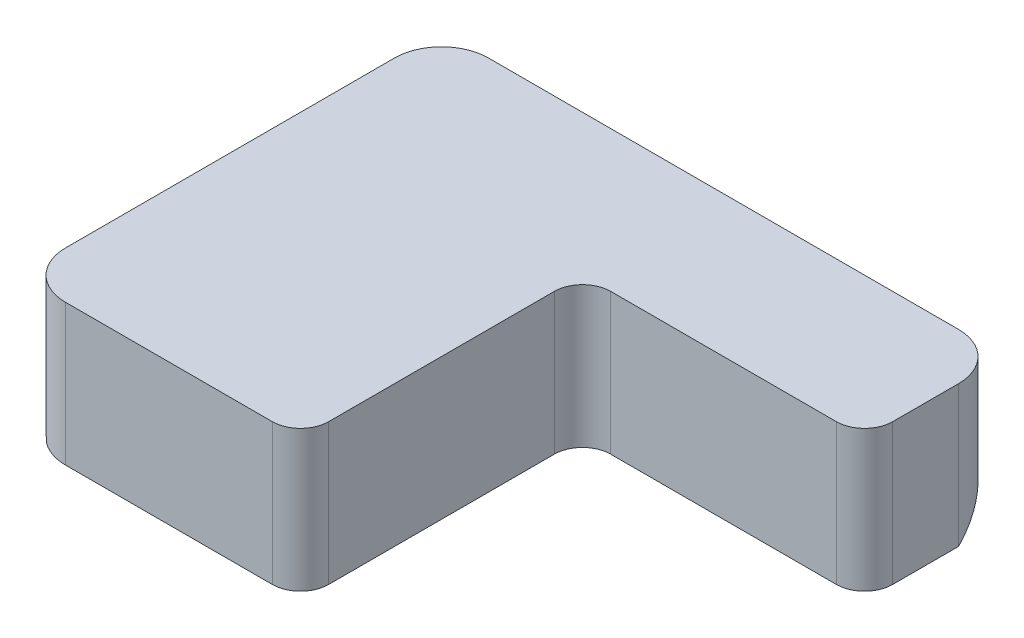
ISO-10303-21;
HEADER;
FILE_DESCRIPTION(('STEP AP214'),'2;1');
FILE_NAME('part.step','',(''),(''),'','','');
FILE_SCHEMA(('AUTOMOTIVE_DESIGN { 1 0 10303 214 1 1 1 1 }'));
ENDSEC;
DATA;
#1=APPLICATION_CONTEXT('core data for automotive mechanical design processes');
#2=APPLICATION_PROTOCOL_DEFINITION('international standard','automotive_design',2000,#1);
#3=PRODUCT_CONTEXT('',#1,'mechanical');
#4=PRODUCT('Part','Part','',(#3));
#5=PRODUCT_RELATED_PRODUCT_CATEGORY('part','',(#4));
#6=PRODUCT_DEFINITION_FORMATION('','',#4);
#7=PRODUCT_DEFINITION_CONTEXT('part definition',#1,'design');
#8=PRODUCT_DEFINITION('design','',#6,#7);
#9=PRODUCT_DEFINITION_SHAPE('','',#8);
#10=(LENGTH_UNIT() NAMED_UNIT(*) SI_UNIT(.MILLI.,.METRE.));
#11=(NAMED_UNIT(*) PLANE_ANGLE_UNIT() SI_UNIT($,.RADIAN.));
#12=(NAMED_UNIT(*) SI_UNIT($,.STERADIAN.) SOLID_ANGLE_UNIT());
#13=UNCERTAINTY_MEASURE_WITH_UNIT(LENGTH_MEASURE(1.E-05),#10,'distance_accuracy_value','');
#14=(GEOMETRIC_REPRESENTATION_CONTEXT(3) GLOBAL_UNCERTAINTY_ASSIGNED_CONTEXT((#13)) GLOBAL_UNIT_ASSIGNED_CONTEXT((#10,
#11,#12)) REPRESENTATION_CONTEXT('',''));
#15=CARTESIAN_POINT('',(0.,0.,0.));
#16=DIRECTION('',(0.,0.,1.));
#17=DIRECTION('',(1.,0.,0.));
#18=AXIS2_PLACEMENT_3D('',#15,#16,#17);
#19=CARTESIAN_POINT('',(0.,15.,30.));
#20=DIRECTION('',(-1.,0.,0.));
#21=DIRECTION('',(0.,0.,1.));
#22=AXIS2_PLACEMENT_3D('',#19,#20,#21);
#23=PLANE('',#22);
#24=DIRECTION('',(0.,0.,-1.));
#25=VECTOR('',#24,1.);
#26=CARTESIAN_POINT('',(0.,15.,30.));
#27=LINE('',#26,#25);
#28=CARTESIAN_POINT('',(0.,15.,27.));
#29=VERTEX_POINT('',#28);
#30=CARTESIAN_POINT('',(0.,15.,3.));
#31=VERTEX_POINT('',#30);
#32=EDGE_CURVE('E259',#29,#31,#27,.T.);
#33=ORIENTED_EDGE('',*,*,#32,.F.);
#34=DIRECTION('',(0.,-1.,0.));
#35=VECTOR('',#34,1.);
#36=CARTESIAN_POINT('',(0.,15.,27.));
#37=LINE('',#36,#35);
#38=CARTESIAN_POINT('',(0.,0.,27.));
#39=VERTEX_POINT('',#38);
#40=EDGE_CURVE('E223',#29,#39,#37,.T.);
#41=ORIENTED_EDGE('',*,*,#40,.T.);
#42=DIRECTION('',(0.,0.,-1.));
#43=VECTOR('',#42,1.);
#44=CARTESIAN_POINT('',(0.,0.,30.));
#45=LINE('',#44,#43);
#46=CARTESIAN_POINT('',(0.,0.,3.));
#47=VERTEX_POINT('',#46);
#48=EDGE_CURVE('E254',#39,#47,#45,.T.);
#49=ORIENTED_EDGE('',*,*,#48,.T.);
#50=DIRECTION('',(0.,-1.,0.));
#51=VECTOR('',#50,1.);
#52=CARTESIAN_POINT('',(0.,15.,3.));
#53=LINE('',#52,#51);
#54=EDGE_CURVE('E221',#47,#31,#53,.F.);
#55=ORIENTED_EDGE('',*,*,#54,.T.);
#56=EDGE_LOOP('',(#33,#41,#49,#55));
#57=FACE_BOUND('',#56,.T.);
#58=ADVANCED_FACE('F41',(#57),#23,.F.);
#59=CARTESIAN_POINT('',(0.,15.,0.));
#60=DIRECTION('',(0.,0.,-1.));
#61=DIRECTION('',(-1.,0.,0.));
#62=AXIS2_PLACEMENT_3D('',#59,#60,#61);
#63=PLANE('',#62);
#64=DIRECTION('',(1.,0.,0.));
#65=VECTOR('',#64,1.);
#66=CARTESIAN_POINT('',(0.,0.,0.));
#67=LINE('',#66,#65);
#68=CARTESIAN_POINT('',(3.,0.,0.));
#69=VERTEX_POINT('',#68);
#70=CARTESIAN_POINT('',(27.,0.,0.));
#71=VERTEX_POINT('',#70);
#72=EDGE_CURVE('E168',#69,#71,#67,.T.);
#73=ORIENTED_EDGE('',*,*,#72,.T.);
#74=DIRECTION('',(0.,-1.,0.));
#75=VECTOR('',#74,1.);
#76=CARTESIAN_POINT('',(27.,15.,0.));
#77=LINE('',#76,#75);
#78=CARTESIAN_POINT('',(27.,15.,0.));
#79=VERTEX_POINT('',#78);
#80=EDGE_CURVE('E215',#71,#79,#77,.F.);
#81=ORIENTED_EDGE('',*,*,#80,.T.);
#82=DIRECTION('',(1.,0.,0.));
#83=VECTOR('',#82,1.);
#84=CARTESIAN_POINT('',(0.,15.,0.));
#85=LINE('',#84,#83);
#86=CARTESIAN_POINT('',(3.,15.,0.));
#87=VERTEX_POINT('',#86);
#88=EDGE_CURVE('E249',#87,#79,#85,.T.);
#89=ORIENTED_EDGE('',*,*,#88,.F.);
#90=DIRECTION('',(0.,-1.,0.));
#91=VECTOR('',#90,1.);
#92=CARTESIAN_POINT('',(3.,0.,0.));
#93=LINE('',#92,#91);
#94=EDGE_CURVE('E212',#87,#69,#93,.T.);
#95=ORIENTED_EDGE('',*,*,#94,.T.);
#96=EDGE_LOOP('',(#73,#81,#89,#95));
#97=FACE_BOUND('',#96,.T.);
#98=ADVANCED_FACE('F274',(#97),#63,.F.);
#99=CARTESIAN_POINT('',(30.,15.,0.));
#100=DIRECTION('',(-1.,0.,0.));
#101=DIRECTION('',(0.,0.,1.));
#102=AXIS2_PLACEMENT_3D('',#99,#100,#101);
#103=PLANE('',#102);
#104=DIRECTION('',(0.,0.,-1.));
#105=VECTOR('',#104,1.);
#106=CARTESIAN_POINT('',(30.,0.,0.));
#107=LINE('',#106,#105);
#108=CARTESIAN_POINT('',(30.,0.,-3.));
#109=VERTEX_POINT('',#108);
#110=CARTESIAN_POINT('',(30.,0.,-9.99999999999998));
#111=VERTEX_POINT('',#110);
#112=EDGE_CURVE('E160',#109,#111,#107,.T.);
#113=ORIENTED_EDGE('',*,*,#112,.T.);
#114=DIRECTION('',(0.,-1.,0.));
#115=VECTOR('',#114,1.);
#116=CARTESIAN_POINT('',(30.,15.,-10.));
#117=LINE('',#116,#115);
#118=CARTESIAN_POINT('',(30.,15.,-10.));
#119=VERTEX_POINT('',#118);
#120=EDGE_CURVE('E154',#111,#119,#117,.F.);
#121=ORIENTED_EDGE('',*,*,#120,.T.);
#122=DIRECTION('',(0.,0.,-1.));
#123=VECTOR('',#122,1.);
#124=CARTESIAN_POINT('',(30.,15.,0.));
#125=LINE('',#124,#123);
#126=CARTESIAN_POINT('',(30.,15.,-3.));
#127=VERTEX_POINT('',#126);
#128=EDGE_CURVE('E246',#127,#119,#125,.T.);
#129=ORIENTED_EDGE('',*,*,#128,.F.);
#130=DIRECTION('',(0.,-1.,0.));
#131=VECTOR('',#130,1.);
#132=CARTESIAN_POINT('',(30.,15.,-3.));
#133=LINE('',#132,#131);
#134=EDGE_CURVE('E165',#127,#109,#133,.T.);
#135=ORIENTED_EDGE('',*,*,#134,.T.);
#136=EDGE_LOOP('',(#113,#121,#129,#135));
#137=FACE_BOUND('',#136,.T.);
#138=ADVANCED_FACE('F161',(#137),#103,.F.);
#139=CARTESIAN_POINT('',(30.,15.,-15.));
#140=DIRECTION('',(0.,0.,1.));
#141=DIRECTION('',(1.,0.,0.));
#142=AXIS2_PLACEMENT_3D('',#139,#140,#141);
#143=PLANE('',#142);
#144=DIRECTION('',(-1.,0.,0.));
#145=VECTOR('',#144,1.);
#146=CARTESIAN_POINT('',(30.,15.,-15.));
#147=LINE('',#146,#145);
#148=CARTESIAN_POINT('',(25.,15.,-15.));
#149=VERTEX_POINT('',#148);
#150=CARTESIAN_POINT('',(-25.,15.,-15.));
#151=VERTEX_POINT('',#150);
#152=EDGE_CURVE('E245',#149,#151,#147,.T.);
#153=ORIENTED_EDGE('',*,*,#152,.F.);
#154=DIRECTION('',(0.,-1.,0.));
#155=VECTOR('',#154,1.);
#156=CARTESIAN_POINT('',(25.,15.,-15.));
#157=LINE('',#156,#155);
#158=CARTESIAN_POINT('',(25.,5.,-15.));
#159=VERTEX_POINT('',#158);
#160=EDGE_CURVE('E235',#149,#159,#157,.T.);
#161=ORIENTED_EDGE('',*,*,#160,.T.);
#162=DIRECTION('',(-1.,0.,0.));
#163=VECTOR('',#162,1.);
#164=CARTESIAN_POINT('',(-30.,5.,-15.));
#165=LINE('',#164,#163);
#166=CARTESIAN_POINT('',(-25.,5.,-15.));
#167=VERTEX_POINT('',#166);
#168=EDGE_CURVE('E149',#159,#167,#165,.T.);
#169=ORIENTED_EDGE('',*,*,#168,.T.);
#170=DIRECTION('',(0.,-1.,0.));
#171=VECTOR('',#170,1.);
#172=CARTESIAN_POINT('',(-25.,15.,-15.));
#173=LINE('',#172,#171);
#174=EDGE_CURVE('E233',#167,#151,#173,.F.);
#175=ORIENTED_EDGE('',*,*,#174,.T.);
#176=EDGE_LOOP('',(#153,#161,#169,#175));
#177=FACE_BOUND('',#176,.T.);
#178=ADVANCED_FACE('F239',(#177),#143,.F.);
#179=CARTESIAN_POINT('',(-30.,15.,-15.));
#180=DIRECTION('',(1.,0.,0.));
#181=DIRECTION('',(0.,0.,-1.));
#182=AXIS2_PLACEMENT_3D('',#179,#180,#181);
#183=PLANE('',#182);
#184=DIRECTION('',(0.,0.,1.));
#185=VECTOR('',#184,1.);
#186=CARTESIAN_POINT('',(-30.,2.00000000000002,30.));
#187=LINE('',#186,#185);
#188=CARTESIAN_POINT('',(-30.,2.00000000000002,-9.99999999999999));
#189=VERTEX_POINT('',#188);
#190=CARTESIAN_POINT('',(-30.,2.00000000000002,25.));
#191=VERTEX_POINT('',#190);
#192=EDGE_CURVE('E173',#189,#191,#187,.T.);
#193=ORIENTED_EDGE('',*,*,#192,.T.);
#194=DIRECTION('',(0.,-1.,0.));
#195=VECTOR('',#194,1.);
#196=CARTESIAN_POINT('',(-30.,15.,25.));
#197=LINE('',#196,#195);
#198=CARTESIAN_POINT('',(-30.,15.,25.));
#199=VERTEX_POINT('',#198);
#200=EDGE_CURVE('E11',#191,#199,#197,.F.);
#201=ORIENTED_EDGE('',*,*,#200,.T.);
#202=DIRECTION('',(0.,0.,1.));
#203=VECTOR('',#202,1.);
#204=CARTESIAN_POINT('',(-30.,15.,-15.));
#205=LINE('',#204,#203);
#206=CARTESIAN_POINT('',(-30.,15.,-9.99999999999999));
#207=VERTEX_POINT('',#206);
#208=EDGE_CURVE('E197',#207,#199,#205,.T.);
#209=ORIENTED_EDGE('',*,*,#208,.F.);
#210=DIRECTION('',(0.,-1.,0.));
#211=VECTOR('',#210,1.);
#212=CARTESIAN_POINT('',(-30.,15.,-9.99999999999999));
#213=LINE('',#212,#211);
#214=EDGE_CURVE('E49',#207,#189,#213,.T.);
#215=ORIENTED_EDGE('',*,*,#214,.T.);
#216=EDGE_LOOP('',(#193,#201,#209,#215));
#217=FACE_BOUND('',#216,.T.);
#218=ADVANCED_FACE('F194',(#217),#183,.F.);
#219=CARTESIAN_POINT('',(-30.,15.,30.));
#220=DIRECTION('',(0.,0.,-1.));
#221=DIRECTION('',(-1.,0.,0.));
#222=AXIS2_PLACEMENT_3D('',#219,#220,#221);
#223=PLANE('',#222);
#224=DIRECTION('',(1.,0.,0.));
#225=VECTOR('',#224,1.);
#226=CARTESIAN_POINT('',(-30.,15.,30.));
#227=LINE('',#226,#225);
#228=CARTESIAN_POINT('',(-25.,15.,30.));
#229=VERTEX_POINT('',#228);
#230=CARTESIAN_POINT('',(-3.,15.,30.));
#231=VERTEX_POINT('',#230);
#232=EDGE_CURVE('E241',#229,#231,#227,.T.);
#233=ORIENTED_EDGE('',*,*,#232,.F.);
#234=DIRECTION('',(0.,-1.,0.));
#235=VECTOR('',#234,1.);
#236=CARTESIAN_POINT('',(-25.,15.,30.));
#237=LINE('',#236,#235);
#238=CARTESIAN_POINT('',(-25.,0.,30.));
#239=VERTEX_POINT('',#238);
#240=EDGE_CURVE('E186',#229,#239,#237,.T.);
#241=ORIENTED_EDGE('',*,*,#240,.T.);
#242=DIRECTION('',(1.,0.,0.));
#243=VECTOR('',#242,1.);
#244=CARTESIAN_POINT('',(-30.,0.,30.));
#245=LINE('',#244,#243);
#246=CARTESIAN_POINT('',(-3.,0.,30.));
#247=VERTEX_POINT('',#246);
#248=EDGE_CURVE('E167',#239,#247,#245,.T.);
#249=ORIENTED_EDGE('',*,*,#248,.T.);
#250=DIRECTION('',(0.,-1.,0.));
#251=VECTOR('',#250,1.);
#252=CARTESIAN_POINT('',(-3.,15.,30.));
#253=LINE('',#252,#251);
#254=EDGE_CURVE('E226',#247,#231,#253,.F.);
#255=ORIENTED_EDGE('',*,*,#254,.T.);
#256=EDGE_LOOP('',(#233,#241,#249,#255));
#257=FACE_BOUND('',#256,.T.);
#258=ADVANCED_FACE('F289',(#257),#223,.F.);
#259=CARTESIAN_POINT('',(0.,15.,0.));
#260=DIRECTION('',(0.,-1.,0.));
#261=DIRECTION('',(0.,0.,-1.));
#262=AXIS2_PLACEMENT_3D('',#259,#260,#261);
#263=PLANE('',#262);
#264=ORIENTED_EDGE('',*,*,#128,.T.);
#265=CARTESIAN_POINT('',(25.,15.,-10.));
#266=DIRECTION('',(0.,-1.,0.));
#267=DIRECTION('',(0.,0.,-1.));
#268=AXIS2_PLACEMENT_3D('',#265,#266,#267);
#269=CIRCLE('',#268,5.);
#270=EDGE_CURVE('E177',#119,#149,#269,.F.);
#271=ORIENTED_EDGE('',*,*,#270,.T.);
#272=ORIENTED_EDGE('',*,*,#152,.T.);
#273=CARTESIAN_POINT('',(-25.,15.,-9.99999999999999));
#274=DIRECTION('',(0.,-1.,0.));
#275=DIRECTION('',(0.,0.,-1.));
#276=AXIS2_PLACEMENT_3D('',#273,#274,#275);
#277=CIRCLE('',#276,5.);
#278=EDGE_CURVE('E178',#151,#207,#277,.F.);
#279=ORIENTED_EDGE('',*,*,#278,.T.);
#280=ORIENTED_EDGE('',*,*,#208,.T.);
#281=CARTESIAN_POINT('',(-25.,15.,25.));
#282=DIRECTION('',(0.,-1.,0.));
#283=DIRECTION('',(0.,0.,-1.));
#284=AXIS2_PLACEMENT_3D('',#281,#282,#283);
#285=CIRCLE('',#284,5.);
#286=EDGE_CURVE('E180',#199,#229,#285,.F.);
#287=ORIENTED_EDGE('',*,*,#286,.T.);
#288=ORIENTED_EDGE('',*,*,#232,.T.);
#289=CARTESIAN_POINT('',(-3.,15.,27.));
#290=DIRECTION('',(0.,-1.,0.));
#291=DIRECTION('',(0.,0.,-1.));
#292=AXIS2_PLACEMENT_3D('',#289,#290,#291);
#293=CIRCLE('',#292,3.);
#294=EDGE_CURVE('E217',#231,#29,#293,.F.);
#295=ORIENTED_EDGE('',*,*,#294,.T.);
#296=ORIENTED_EDGE('',*,*,#32,.T.);
#297=CARTESIAN_POINT('',(3.,15.,3.));
#298=DIRECTION('',(0.,-1.,0.));
#299=DIRECTION('',(0.,0.,-1.));
#300=AXIS2_PLACEMENT_3D('',#297,#298,#299);
#301=CIRCLE('',#300,3.);
#302=EDGE_CURVE('E231',#31,#87,#301,.T.);
#303=ORIENTED_EDGE('',*,*,#302,.T.);
#304=ORIENTED_EDGE('',*,*,#88,.T.);
#305=CARTESIAN_POINT('',(27.,15.,-3.));
#306=DIRECTION('',(0.,-1.,0.));
#307=DIRECTION('',(0.,0.,-1.));
#308=AXIS2_PLACEMENT_3D('',#305,#306,#307);
#309=CIRCLE('',#308,3.);
#310=EDGE_CURVE('E219',#79,#127,#309,.F.);
#311=ORIENTED_EDGE('',*,*,#310,.T.);
#312=EDGE_LOOP('',(#264,#271,#272,#279,#280,#287,#288,#295,#296,#303,#304,#311));
#313=FACE_BOUND('',#312,.T.);
#314=ADVANCED_FACE('F243',(#313),#263,.F.);
#315=CARTESIAN_POINT('',(0.,0.,0.));
#316=DIRECTION('',(0.,-1.,0.));
#317=DIRECTION('',(0.,0.,-1.));
#318=AXIS2_PLACEMENT_3D('',#315,#316,#317);
#319=PLANE('',#318);
#320=ORIENTED_EDGE('',*,*,#248,.F.);
#321=CARTESIAN_POINT('',(-25.,0.,25.));
#322=DIRECTION('',(0.,-1.,0.));
#323=DIRECTION('',(0.,0.,-1.));
#324=AXIS2_PLACEMENT_3D('',#321,#322,#323);
#325=CIRCLE('',#324,5.);
#326=CARTESIAN_POINT('',(-28.,0.,29.));
#327=VERTEX_POINT('',#326);
#328=EDGE_CURVE('E189',#239,#327,#325,.T.);
#329=ORIENTED_EDGE('',*,*,#328,.T.);
#330=DIRECTION('',(0.,0.,-1.));
#331=VECTOR('',#330,1.);
#332=CARTESIAN_POINT('',(-28.,0.,-9.99999999999998));
#333=LINE('',#332,#331);
#334=CARTESIAN_POINT('',(-28.,0.,-9.99999999999997));
#335=VERTEX_POINT('',#334);
#336=EDGE_CURVE('E172',#327,#335,#333,.T.);
#337=ORIENTED_EDGE('',*,*,#336,.T.);
#338=DIRECTION('',(1.,0.,0.));
#339=VECTOR('',#338,1.);
#340=CARTESIAN_POINT('',(30.,0.,-9.99999999999998));
#341=LINE('',#340,#339);
#342=EDGE_CURVE('E146',#335,#111,#341,.T.);
#343=ORIENTED_EDGE('',*,*,#342,.T.);
#344=ORIENTED_EDGE('',*,*,#112,.F.);
#345=CARTESIAN_POINT('',(27.,0.,-3.));
#346=DIRECTION('',(0.,-1.,0.));
#347=DIRECTION('',(0.,0.,-1.));
#348=AXIS2_PLACEMENT_3D('',#345,#346,#347);
#349=CIRCLE('',#348,3.);
#350=EDGE_CURVE('E210',#109,#71,#349,.T.);
#351=ORIENTED_EDGE('',*,*,#350,.T.);
#352=ORIENTED_EDGE('',*,*,#72,.F.);
#353=CARTESIAN_POINT('',(3.,0.,3.));
#354=DIRECTION('',(0.,-1.,0.));
#355=DIRECTION('',(0.,0.,-1.));
#356=AXIS2_PLACEMENT_3D('',#353,#354,#355);
#357=CIRCLE('',#356,3.);
#358=EDGE_CURVE('E229',#69,#47,#357,.F.);
#359=ORIENTED_EDGE('',*,*,#358,.T.);
#360=ORIENTED_EDGE('',*,*,#48,.F.);
#361=CARTESIAN_POINT('',(-3.,0.,27.));
#362=DIRECTION('',(0.,-1.,0.));
#363=DIRECTION('',(0.,0.,-1.));
#364=AXIS2_PLACEMENT_3D('',#361,#362,#363);
#365=CIRCLE('',#364,3.);
#366=EDGE_CURVE('E207',#39,#247,#365,.T.);
#367=ORIENTED_EDGE('',*,*,#366,.T.);
#368=EDGE_LOOP('',(#320,#329,#337,#343,#344,#351,#352,#359,#360,#367));
#369=FACE_BOUND('',#368,.T.);
#370=ADVANCED_FACE('F171',(#369),#319,.T.);
#371=CARTESIAN_POINT('',(30.,5.,-15.));
#372=DIRECTION('',(0.,-0.707106781186549,-0.707106781186547));
#373=DIRECTION('',(1.,0.,0.));
#374=AXIS2_PLACEMENT_3D('',#371,#372,#373);
#375=PLANE('',#374);
#376=ORIENTED_EDGE('',*,*,#168,.F.);
#377=CARTESIAN_POINT('',(25.,0.,-10.));
#378=DIRECTION('',(0.,-0.707106781186549,-0.707106781186547));
#379=DIRECTION('',(0.,-0.707106781186547,0.707106781186549));
#380=AXIS2_PLACEMENT_3D('',#377,#378,#379);
#381=ELLIPSE('',#380,7.07106781186546,5.);
#382=EDGE_CURVE('E141',#159,#111,#381,.T.);
#383=ORIENTED_EDGE('',*,*,#382,.T.);
#384=ORIENTED_EDGE('',*,*,#342,.F.);
#385=DIRECTION('',(-0.577350269189625,0.577350269189625,-0.577350269189627));
#386=VECTOR('',#385,1.);
#387=CARTESIAN_POINT('',(-12.,-15.9999999999999,6.00000000000002));
#388=LINE('',#387,#386);
#389=CARTESIAN_POINT('',(-29.7015621187164,1.70156211871644,-11.7015621187164));
#390=VERTEX_POINT('',#389);
#391=EDGE_CURVE('E201',#335,#390,#388,.T.);
#392=ORIENTED_EDGE('',*,*,#391,.T.);
#393=CARTESIAN_POINT('',(-25.,0.,-9.99999999999999));
#394=DIRECTION('',(0.,-0.707106781186549,-0.707106781186547));
#395=DIRECTION('',(0.,-0.707106781186547,0.707106781186549));
#396=AXIS2_PLACEMENT_3D('',#393,#394,#395);
#397=ELLIPSE('',#396,7.07106781186546,5.);
#398=EDGE_CURVE('E155',#390,#167,#397,.T.);
#399=ORIENTED_EDGE('',*,*,#398,.T.);
#400=EDGE_LOOP('',(#376,#383,#384,#392,#399));
#401=FACE_BOUND('',#400,.T.);
#402=ADVANCED_FACE('F143',(#401),#375,.T.);
#403=CARTESIAN_POINT('',(-30.,2.00000000000002,-15.));
#404=DIRECTION('',(-0.707106781186547,-0.707106781186547,0.));
#405=DIRECTION('',(0.,0.,-1.));
#406=AXIS2_PLACEMENT_3D('',#403,#404,#405);
#407=PLANE('',#406);
#408=ORIENTED_EDGE('',*,*,#336,.F.);
#409=CARTESIAN_POINT('',(-25.,-2.99999999999998,25.));
#410=DIRECTION('',(-0.707106781186547,-0.707106781186547,0.));
#411=DIRECTION('',(0.707106781186548,-0.707106781186548,0.));
#412=AXIS2_PLACEMENT_3D('',#409,#410,#411);
#413=ELLIPSE('',#412,7.07106781186548,5.);
#414=EDGE_CURVE('E56',#327,#191,#413,.T.);
#415=ORIENTED_EDGE('',*,*,#414,.T.);
#416=ORIENTED_EDGE('',*,*,#192,.F.);
#417=CARTESIAN_POINT('',(-25.,-2.99999999999998,-9.99999999999999));
#418=DIRECTION('',(-0.707106781186547,-0.707106781186547,0.));
#419=DIRECTION('',(0.707106781186548,-0.707106781186548,0.));
#420=AXIS2_PLACEMENT_3D('',#417,#418,#419);
#421=ELLIPSE('',#420,7.07106781186548,5.);
#422=EDGE_CURVE('E64',#189,#390,#421,.T.);
#423=ORIENTED_EDGE('',*,*,#422,.T.);
#424=ORIENTED_EDGE('',*,*,#391,.F.);
#425=EDGE_LOOP('',(#408,#415,#416,#423,#424));
#426=FACE_BOUND('',#425,.T.);
#427=ADVANCED_FACE('F199',(#426),#407,.T.);
#428=CARTESIAN_POINT('',(27.,15.,-3.));
#429=DIRECTION('',(0.,-1.,0.));
#430=DIRECTION('',(0.,0.,-1.));
#431=AXIS2_PLACEMENT_3D('',#428,#429,#430);
#432=CYLINDRICAL_SURFACE('',#431,3.);
#433=ORIENTED_EDGE('',*,*,#310,.F.);
#434=ORIENTED_EDGE('',*,*,#80,.F.);
#435=ORIENTED_EDGE('',*,*,#350,.F.);
#436=ORIENTED_EDGE('',*,*,#134,.F.);
#437=EDGE_LOOP('',(#433,#434,#435,#436));
#438=FACE_BOUND('',#437,.T.);
#439=ADVANCED_FACE('F272',(#438),#432,.T.);
#440=CARTESIAN_POINT('',(-3.,15.,27.));
#441=DIRECTION('',(0.,-1.,0.));
#442=DIRECTION('',(0.,0.,-1.));
#443=AXIS2_PLACEMENT_3D('',#440,#441,#442);
#444=CYLINDRICAL_SURFACE('',#443,3.);
#445=ORIENTED_EDGE('',*,*,#294,.F.);
#446=ORIENTED_EDGE('',*,*,#254,.F.);
#447=ORIENTED_EDGE('',*,*,#366,.F.);
#448=ORIENTED_EDGE('',*,*,#40,.F.);
#449=EDGE_LOOP('',(#445,#446,#447,#448));
#450=FACE_BOUND('',#449,.T.);
#451=ADVANCED_FACE('F283',(#450),#444,.T.);
#452=CARTESIAN_POINT('',(3.,15.,3.));
#453=DIRECTION('',(0.,1.,0.));
#454=DIRECTION('',(0.,0.,1.));
#455=AXIS2_PLACEMENT_3D('',#452,#453,#454);
#456=CYLINDRICAL_SURFACE('',#455,3.);
#457=ORIENTED_EDGE('',*,*,#302,.F.);
#458=ORIENTED_EDGE('',*,*,#54,.F.);
#459=ORIENTED_EDGE('',*,*,#358,.F.);
#460=ORIENTED_EDGE('',*,*,#94,.F.);
#461=EDGE_LOOP('',(#457,#458,#459,#460));
#462=FACE_BOUND('',#461,.T.);
#463=ADVANCED_FACE('F276',(#462),#456,.F.);
#464=CARTESIAN_POINT('',(25.,15.,-10.));
#465=DIRECTION('',(0.,-1.,0.));
#466=DIRECTION('',(0.,0.,-1.));
#467=AXIS2_PLACEMENT_3D('',#464,#465,#466);
#468=CYLINDRICAL_SURFACE('',#467,5.);
#469=ORIENTED_EDGE('',*,*,#270,.F.);
#470=ORIENTED_EDGE('',*,*,#120,.F.);
#471=ORIENTED_EDGE('',*,*,#382,.F.);
#472=ORIENTED_EDGE('',*,*,#160,.F.);
#473=EDGE_LOOP('',(#469,#470,#471,#472));
#474=FACE_BOUND('',#473,.T.);
#475=ADVANCED_FACE('F176',(#474),#468,.T.);
#476=CARTESIAN_POINT('',(-25.,15.,25.));
#477=DIRECTION('',(0.,-1.,0.));
#478=DIRECTION('',(0.,0.,-1.));
#479=AXIS2_PLACEMENT_3D('',#476,#477,#478);
#480=CYLINDRICAL_SURFACE('',#479,5.);
#481=ORIENTED_EDGE('',*,*,#286,.F.);
#482=ORIENTED_EDGE('',*,*,#200,.F.);
#483=ORIENTED_EDGE('',*,*,#414,.F.);
#484=ORIENTED_EDGE('',*,*,#328,.F.);
#485=ORIENTED_EDGE('',*,*,#240,.F.);
#486=EDGE_LOOP('',(#481,#482,#483,#484,#485));
#487=FACE_BOUND('',#486,.T.);
#488=ADVANCED_FACE('F287',(#487),#480,.T.);
#489=CARTESIAN_POINT('',(-25.,15.,-9.99999999999999));
#490=DIRECTION('',(0.,-1.,0.));
#491=DIRECTION('',(0.,0.,-1.));
#492=AXIS2_PLACEMENT_3D('',#489,#490,#491);
#493=CYLINDRICAL_SURFACE('',#492,5.);
#494=ORIENTED_EDGE('',*,*,#278,.F.);
#495=ORIENTED_EDGE('',*,*,#174,.F.);
#496=ORIENTED_EDGE('',*,*,#398,.F.);
#497=ORIENTED_EDGE('',*,*,#422,.F.);
#498=ORIENTED_EDGE('',*,*,#214,.F.);
#499=EDGE_LOOP('',(#494,#495,#496,#497,#498));
#500=FACE_BOUND('',#499,.T.);
#501=ADVANCED_FACE('F43',(#500),#493,.T.);
#502=CLOSED_SHELL('',(#58,#98,#138,#178,#218,#258,#314,#370,#402,#427,#439,#451,#463,#475,#488,#501));
#503=MANIFOLD_SOLID_BREP('B2',#502);
#504=ADVANCED_BREP_SHAPE_REPRESENTATION('',(#18,#503),#14);
#505=SHAPE_DEFINITION_REPRESENTATION(#9,#504);
ENDSEC;
END-ISO-10303-21;
